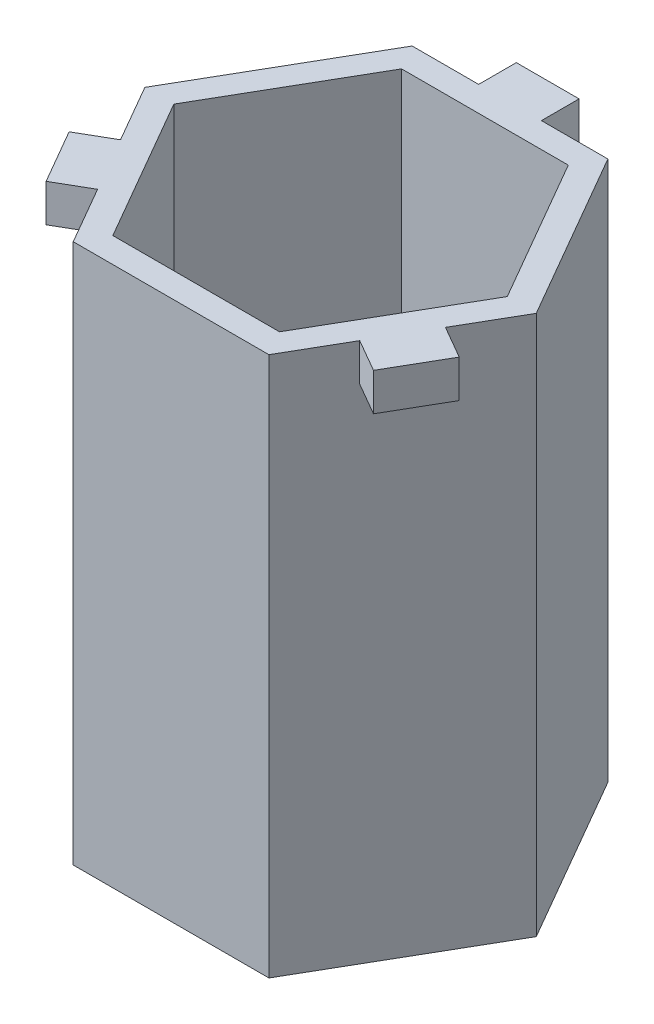
ISO-10303-21;
HEADER;
FILE_DESCRIPTION(('STEP AP214'),'2;1');
FILE_NAME('part.step','',(''),(''),'','','');
FILE_SCHEMA(('AUTOMOTIVE_DESIGN { 1 0 10303 214 1 1 1 1 }'));
ENDSEC;
DATA;
#1=APPLICATION_CONTEXT('core data for automotive mechanical design processes');
#2=APPLICATION_PROTOCOL_DEFINITION('international standard','automotive_design',2000,#1);
#3=PRODUCT_CONTEXT('',#1,'mechanical');
#4=PRODUCT('Part','Part','',(#3));
#5=PRODUCT_RELATED_PRODUCT_CATEGORY('part','',(#4));
#6=PRODUCT_DEFINITION_FORMATION('','',#4);
#7=PRODUCT_DEFINITION_CONTEXT('part definition',#1,'design');
#8=PRODUCT_DEFINITION('design','',#6,#7);
#9=PRODUCT_DEFINITION_SHAPE('','',#8);
#10=(LENGTH_UNIT() NAMED_UNIT(*) SI_UNIT(.MILLI.,.METRE.));
#11=(NAMED_UNIT(*) PLANE_ANGLE_UNIT() SI_UNIT($,.RADIAN.));
#12=(NAMED_UNIT(*) SI_UNIT($,.STERADIAN.) SOLID_ANGLE_UNIT());
#13=UNCERTAINTY_MEASURE_WITH_UNIT(LENGTH_MEASURE(1.E-05),#10,'distance_accuracy_value','');
#14=(GEOMETRIC_REPRESENTATION_CONTEXT(3) GLOBAL_UNCERTAINTY_ASSIGNED_CONTEXT((#13)) GLOBAL_UNIT_ASSIGNED_CONTEXT((#10,
#11,#12)) REPRESENTATION_CONTEXT('',''));
#15=CARTESIAN_POINT('',(0.,0.,0.));
#16=DIRECTION('',(0.,0.,1.));
#17=DIRECTION('',(1.,0.,0.));
#18=AXIS2_PLACEMENT_3D('',#15,#16,#17);
#19=CARTESIAN_POINT('',(7.79422863405995,43.,-13.5));
#20=DIRECTION('',(0.,0.,1.));
#21=DIRECTION('',(1.,0.,0.));
#22=AXIS2_PLACEMENT_3D('',#19,#20,#21);
#23=PLANE('',#22);
#24=DIRECTION('',(0.,1.,0.));
#25=VECTOR('',#24,1.);
#26=CARTESIAN_POINT('',(-2.5,40.,-13.5));
#27=LINE('',#26,#25);
#28=CARTESIAN_POINT('',(-2.5,40.,-13.5));
#29=VERTEX_POINT('',#28);
#30=CARTESIAN_POINT('',(-2.5,43.,-13.5));
#31=VERTEX_POINT('',#30);
#32=EDGE_CURVE('E277',#29,#31,#27,.T.);
#33=ORIENTED_EDGE('',*,*,#32,.F.);
#34=DIRECTION('',(1.,0.,0.));
#35=VECTOR('',#34,1.);
#36=CARTESIAN_POINT('',(-2.5,40.,-13.5));
#37=LINE('',#36,#35);
#38=CARTESIAN_POINT('',(2.5,40.,-13.5));
#39=VERTEX_POINT('',#38);
#40=EDGE_CURVE('E267',#29,#39,#37,.T.);
#41=ORIENTED_EDGE('',*,*,#40,.T.);
#42=DIRECTION('',(0.,1.,0.));
#43=VECTOR('',#42,1.);
#44=CARTESIAN_POINT('',(2.5,40.,-13.5));
#45=LINE('',#44,#43);
#46=CARTESIAN_POINT('',(2.5,43.,-13.5));
#47=VERTEX_POINT('',#46);
#48=EDGE_CURVE('E290',#39,#47,#45,.T.);
#49=ORIENTED_EDGE('',*,*,#48,.T.);
#50=DIRECTION('',(-1.,0.,0.));
#51=VECTOR('',#50,1.);
#52=CARTESIAN_POINT('',(7.79422863405995,43.,-13.5));
#53=LINE('',#52,#51);
#54=CARTESIAN_POINT('',(7.79422863405995,43.,-13.5));
#55=VERTEX_POINT('',#54);
#56=EDGE_CURVE('E345',#55,#47,#53,.T.);
#57=ORIENTED_EDGE('',*,*,#56,.F.);
#58=DIRECTION('',(0.,-1.,0.));
#59=VECTOR('',#58,1.);
#60=CARTESIAN_POINT('',(7.79422863405995,43.,-13.5));
#61=LINE('',#60,#59);
#62=CARTESIAN_POINT('',(7.79422863405995,0.,-13.5));
#63=VERTEX_POINT('',#62);
#64=EDGE_CURVE('E48',#55,#63,#61,.T.);
#65=ORIENTED_EDGE('',*,*,#64,.T.);
#66=DIRECTION('',(-1.,0.,0.));
#67=VECTOR('',#66,1.);
#68=CARTESIAN_POINT('',(7.79422863405995,0.,-13.5));
#69=LINE('',#68,#67);
#70=CARTESIAN_POINT('',(-7.79422863405995,0.,-13.5));
#71=VERTEX_POINT('',#70);
#72=EDGE_CURVE('E359',#63,#71,#69,.T.);
#73=ORIENTED_EDGE('',*,*,#72,.T.);
#74=DIRECTION('',(0.,-1.,0.));
#75=VECTOR('',#74,1.);
#76=CARTESIAN_POINT('',(-7.79422863405995,43.,-13.5));
#77=LINE('',#76,#75);
#78=CARTESIAN_POINT('',(-7.79422863405995,43.,-13.5));
#79=VERTEX_POINT('',#78);
#80=EDGE_CURVE('E375',#79,#71,#77,.T.);
#81=ORIENTED_EDGE('',*,*,#80,.F.);
#82=EDGE_CURVE('E344',#31,#79,#53,.T.);
#83=ORIENTED_EDGE('',*,*,#82,.F.);
#84=EDGE_LOOP('',(#33,#41,#49,#57,#65,#73,#81,#83));
#85=FACE_BOUND('',#84,.T.);
#86=ADVANCED_FACE('F39',(#85),#23,.F.);
#87=CARTESIAN_POINT('',(0.,43.,0.));
#88=DIRECTION('',(0.,-1.,0.));
#89=DIRECTION('',(0.,0.,-1.));
#90=AXIS2_PLACEMENT_3D('',#87,#88,#89);
#91=CYLINDRICAL_SURFACE('',#90,10.7);
#92=CARTESIAN_POINT('',(0.,0.,0.));
#93=DIRECTION('',(0.,1.,0.));
#94=DIRECTION('',(0.,0.,1.));
#95=AXIS2_PLACEMENT_3D('',#92,#93,#94);
#96=CIRCLE('',#95,10.7);
#97=CARTESIAN_POINT('',(0.,0.,10.7));
#98=VERTEX_POINT('',#97);
#99=EDGE_CURVE('E335',#98,#98,#96,.T.);
#100=ORIENTED_EDGE('',*,*,#99,.F.);
#101=EDGE_LOOP('',(#100));
#102=FACE_BOUND('',#101,.T.);
#103=CARTESIAN_POINT('',(0.,3.,0.));
#104=DIRECTION('',(0.,1.,0.));
#105=DIRECTION('',(0.,0.,1.));
#106=AXIS2_PLACEMENT_3D('',#103,#104,#105);
#107=CIRCLE('',#106,10.7);
#108=CARTESIAN_POINT('',(0.,3.,10.7));
#109=VERTEX_POINT('',#108);
#110=EDGE_CURVE('E43',#109,#109,#107,.T.);
#111=ORIENTED_EDGE('',*,*,#110,.T.);
#112=EDGE_LOOP('',(#111));
#113=FACE_BOUND('',#112,.T.);
#114=ADVANCED_FACE('F439',(#102,#113),#91,.F.);
#115=CARTESIAN_POINT('',(0.,43.,0.));
#116=DIRECTION('',(0.,1.,0.));
#117=DIRECTION('',(0.,0.,1.));
#118=AXIS2_PLACEMENT_3D('',#115,#116,#117);
#119=PLANE('',#118);
#120=DIRECTION('',(0.5,0.,-0.866025403784439));
#121=VECTOR('',#120,1.);
#122=CARTESIAN_POINT('',(6.6395280956807,43.,11.5));
#123=LINE('',#122,#121);
#124=CARTESIAN_POINT('',(6.6395280956807,43.,11.5));
#125=VERTEX_POINT('',#124);
#126=CARTESIAN_POINT('',(13.2790561913614,43.,0.));
#127=VERTEX_POINT('',#126);
#128=EDGE_CURVE('E287',#125,#127,#123,.T.);
#129=ORIENTED_EDGE('',*,*,#128,.F.);
#130=DIRECTION('',(1.,0.,0.));
#131=VECTOR('',#130,1.);
#132=CARTESIAN_POINT('',(-6.6395280956807,43.,11.5));
#133=LINE('',#132,#131);
#134=CARTESIAN_POINT('',(-6.6395280956807,43.,11.5));
#135=VERTEX_POINT('',#134);
#136=EDGE_CURVE('E319',#135,#125,#133,.T.);
#137=ORIENTED_EDGE('',*,*,#136,.F.);
#138=DIRECTION('',(0.5,0.,0.866025403784439));
#139=VECTOR('',#138,1.);
#140=CARTESIAN_POINT('',(-13.2790561913614,43.,0.));
#141=LINE('',#140,#139);
#142=CARTESIAN_POINT('',(-13.2790561913614,43.,0.));
#143=VERTEX_POINT('',#142);
#144=EDGE_CURVE('E316',#143,#135,#141,.T.);
#145=ORIENTED_EDGE('',*,*,#144,.F.);
#146=DIRECTION('',(-0.5,0.,0.866025403784439));
#147=VECTOR('',#146,1.);
#148=CARTESIAN_POINT('',(-6.6395280956807,43.,-11.5));
#149=LINE('',#148,#147);
#150=CARTESIAN_POINT('',(-6.6395280956807,43.,-11.5));
#151=VERTEX_POINT('',#150);
#152=EDGE_CURVE('E313',#151,#143,#149,.T.);
#153=ORIENTED_EDGE('',*,*,#152,.F.);
#154=DIRECTION('',(-1.,0.,0.));
#155=VECTOR('',#154,1.);
#156=CARTESIAN_POINT('',(6.63952809568069,43.,-11.5));
#157=LINE('',#156,#155);
#158=CARTESIAN_POINT('',(6.63952809568069,43.,-11.5));
#159=VERTEX_POINT('',#158);
#160=EDGE_CURVE('E310',#159,#151,#157,.T.);
#161=ORIENTED_EDGE('',*,*,#160,.F.);
#162=DIRECTION('',(-0.5,0.,-0.866025403784439));
#163=VECTOR('',#162,1.);
#164=CARTESIAN_POINT('',(13.2790561913614,43.,0.));
#165=LINE('',#164,#163);
#166=EDGE_CURVE('E307',#127,#159,#165,.T.);
#167=ORIENTED_EDGE('',*,*,#166,.F.);
#168=EDGE_LOOP('',(#129,#137,#145,#153,#161,#167));
#169=FACE_BOUND('',#168,.T.);
#170=DIRECTION('',(0.499999999999999,0.,-0.866025403784439));
#171=VECTOR('',#170,1.);
#172=CARTESIAN_POINT('',(7.79422863405995,43.,13.5));
#173=LINE('',#172,#171);
#174=CARTESIAN_POINT('',(7.79422863405995,43.,13.5));
#175=VERTEX_POINT('',#174);
#176=CARTESIAN_POINT('',(10.4413429510904,43.,8.91506350946066));
#177=VERTEX_POINT('',#176);
#178=EDGE_CURVE('E339',#175,#177,#173,.T.);
#179=ORIENTED_EDGE('',*,*,#178,.T.);
#180=DIRECTION('',(0.866025403784439,0.,0.499999999999999));
#181=VECTOR('',#180,1.);
#182=CARTESIAN_POINT('',(13.0394191624438,43.,10.4150635094607));
#183=LINE('',#182,#181);
#184=CARTESIAN_POINT('',(13.0394191624438,43.,10.4150635094607));
#185=VERTEX_POINT('',#184);
#186=EDGE_CURVE('E246',#177,#185,#183,.T.);
#187=ORIENTED_EDGE('',*,*,#186,.T.);
#188=DIRECTION('',(0.5,0.,-0.866025403784439));
#189=VECTOR('',#188,1.);
#190=CARTESIAN_POINT('',(15.5394191624438,43.,6.08493649053846));
#191=LINE('',#190,#189);
#192=CARTESIAN_POINT('',(15.5394191624438,43.,6.08493649053846));
#193=VERTEX_POINT('',#192);
#194=EDGE_CURVE('E251',#185,#193,#191,.T.);
#195=ORIENTED_EDGE('',*,*,#194,.T.);
#196=DIRECTION('',(-0.866025403784438,0.,-0.500000000000001));
#197=VECTOR('',#196,1.);
#198=CARTESIAN_POINT('',(15.5394191624438,43.,6.08493649053846));
#199=LINE('',#198,#197);
#200=CARTESIAN_POINT('',(12.9413429510902,43.,4.58493649053846));
#201=VERTEX_POINT('',#200);
#202=EDGE_CURVE('E62',#193,#201,#199,.T.);
#203=ORIENTED_EDGE('',*,*,#202,.T.);
#204=CARTESIAN_POINT('',(15.5884572681199,43.,0.));
#205=VERTEX_POINT('',#204);
#206=EDGE_CURVE('E342',#201,#205,#173,.T.);
#207=ORIENTED_EDGE('',*,*,#206,.T.);
#208=DIRECTION('',(-0.5,0.,-0.866025403784439));
#209=VECTOR('',#208,1.);
#210=CARTESIAN_POINT('',(15.5884572681199,43.,0.));
#211=LINE('',#210,#209);
#212=EDGE_CURVE('E341',#205,#55,#211,.T.);
#213=ORIENTED_EDGE('',*,*,#212,.T.);
#214=ORIENTED_EDGE('',*,*,#56,.T.);
#215=DIRECTION('',(0.,0.,-1.));
#216=VECTOR('',#215,1.);
#217=CARTESIAN_POINT('',(2.5,43.,-16.5));
#218=LINE('',#217,#216);
#219=CARTESIAN_POINT('',(2.5,43.,-16.5));
#220=VERTEX_POINT('',#219);
#221=EDGE_CURVE('E280',#47,#220,#218,.T.);
#222=ORIENTED_EDGE('',*,*,#221,.T.);
#223=DIRECTION('',(-1.,0.,0.));
#224=VECTOR('',#223,1.);
#225=CARTESIAN_POINT('',(-2.5,43.,-16.5));
#226=LINE('',#225,#224);
#227=CARTESIAN_POINT('',(-2.5,43.,-16.5));
#228=VERTEX_POINT('',#227);
#229=EDGE_CURVE('E268',#220,#228,#226,.T.);
#230=ORIENTED_EDGE('',*,*,#229,.T.);
#231=DIRECTION('',(0.,0.,1.));
#232=VECTOR('',#231,1.);
#233=CARTESIAN_POINT('',(-2.5,43.,-16.5));
#234=LINE('',#233,#232);
#235=EDGE_CURVE('E253',#228,#31,#234,.T.);
#236=ORIENTED_EDGE('',*,*,#235,.T.);
#237=ORIENTED_EDGE('',*,*,#82,.T.);
#238=DIRECTION('',(-0.5,0.,0.866025403784439));
#239=VECTOR('',#238,1.);
#240=CARTESIAN_POINT('',(-7.79422863405995,43.,-13.5));
#241=LINE('',#240,#239);
#242=CARTESIAN_POINT('',(-15.5884572681199,43.,0.));
#243=VERTEX_POINT('',#242);
#244=EDGE_CURVE('E348',#79,#243,#241,.T.);
#245=ORIENTED_EDGE('',*,*,#244,.T.);
#246=DIRECTION('',(0.5,0.,0.866025403784438));
#247=VECTOR('',#246,1.);
#248=CARTESIAN_POINT('',(-15.5884572681199,43.,0.));
#249=LINE('',#248,#247);
#250=CARTESIAN_POINT('',(-12.9413429510893,43.,4.58493649053914));
#251=VERTEX_POINT('',#250);
#252=EDGE_CURVE('E223',#243,#251,#249,.T.);
#253=ORIENTED_EDGE('',*,*,#252,.T.);
#254=DIRECTION('',(-0.866025403784438,0.,0.500000000000001));
#255=VECTOR('',#254,1.);
#256=CARTESIAN_POINT('',(-15.5394191624426,43.,6.08493649053914));
#257=LINE('',#256,#255);
#258=CARTESIAN_POINT('',(-15.5394191624426,43.,6.08493649053914));
#259=VERTEX_POINT('',#258);
#260=EDGE_CURVE('E205',#251,#259,#257,.T.);
#261=ORIENTED_EDGE('',*,*,#260,.T.);
#262=DIRECTION('',(0.5,0.,0.866025403784438));
#263=VECTOR('',#262,1.);
#264=CARTESIAN_POINT('',(-13.0394191624426,43.,10.4150635094613));
#265=LINE('',#264,#263);
#266=CARTESIAN_POINT('',(-13.0394191624426,43.,10.4150635094613));
#267=VERTEX_POINT('',#266);
#268=EDGE_CURVE('E214',#259,#267,#265,.T.);
#269=ORIENTED_EDGE('',*,*,#268,.T.);
#270=DIRECTION('',(0.866025403784439,0.,-0.499999999999999));
#271=VECTOR('',#270,1.);
#272=CARTESIAN_POINT('',(-13.0394191624426,43.,10.4150635094613));
#273=LINE('',#272,#271);
#274=CARTESIAN_POINT('',(-10.4413429510893,43.,8.9150635094622));
#275=VERTEX_POINT('',#274);
#276=EDGE_CURVE('E55',#267,#275,#273,.T.);
#277=ORIENTED_EDGE('',*,*,#276,.T.);
#278=CARTESIAN_POINT('',(-7.79422863405994,43.,13.5));
#279=VERTEX_POINT('',#278);
#280=EDGE_CURVE('E350',#275,#279,#249,.T.);
#281=ORIENTED_EDGE('',*,*,#280,.T.);
#282=DIRECTION('',(1.,0.,0.));
#283=VECTOR('',#282,1.);
#284=CARTESIAN_POINT('',(-7.79422863405994,43.,13.5));
#285=LINE('',#284,#283);
#286=EDGE_CURVE('E352',#279,#175,#285,.T.);
#287=ORIENTED_EDGE('',*,*,#286,.T.);
#288=EDGE_LOOP('',(#179,#187,#195,#203,#207,#213,#214,#222,#230,#236,#237,#245,#253,#261,#269,
#277,#281,#287));
#289=FACE_BOUND('',#288,.T.);
#290=ADVANCED_FACE('F221',(#169,#289),#119,.T.);
#291=CARTESIAN_POINT('',(0.,0.,0.));
#292=DIRECTION('',(0.,1.,0.));
#293=DIRECTION('',(0.,0.,1.));
#294=AXIS2_PLACEMENT_3D('',#291,#292,#293);
#295=PLANE('',#294);
#296=DIRECTION('',(0.499999999999999,0.,-0.866025403784439));
#297=VECTOR('',#296,1.);
#298=CARTESIAN_POINT('',(7.79422863405995,0.,13.5));
#299=LINE('',#298,#297);
#300=CARTESIAN_POINT('',(7.79422863405995,0.,13.5));
#301=VERTEX_POINT('',#300);
#302=CARTESIAN_POINT('',(15.5884572681199,0.,0.));
#303=VERTEX_POINT('',#302);
#304=EDGE_CURVE('E338',#301,#303,#299,.T.);
#305=ORIENTED_EDGE('',*,*,#304,.F.);
#306=DIRECTION('',(1.,0.,0.));
#307=VECTOR('',#306,1.);
#308=CARTESIAN_POINT('',(-7.79422863405994,0.,13.5));
#309=LINE('',#308,#307);
#310=CARTESIAN_POINT('',(-7.79422863405994,0.,13.5));
#311=VERTEX_POINT('',#310);
#312=EDGE_CURVE('E365',#311,#301,#309,.T.);
#313=ORIENTED_EDGE('',*,*,#312,.F.);
#314=DIRECTION('',(0.5,0.,0.866025403784438));
#315=VECTOR('',#314,1.);
#316=CARTESIAN_POINT('',(-15.5884572681199,0.,0.));
#317=LINE('',#316,#315);
#318=CARTESIAN_POINT('',(-15.5884572681199,0.,0.));
#319=VERTEX_POINT('',#318);
#320=EDGE_CURVE('E363',#319,#311,#317,.T.);
#321=ORIENTED_EDGE('',*,*,#320,.F.);
#322=DIRECTION('',(-0.5,0.,0.866025403784439));
#323=VECTOR('',#322,1.);
#324=CARTESIAN_POINT('',(-7.79422863405995,0.,-13.5));
#325=LINE('',#324,#323);
#326=EDGE_CURVE('E361',#71,#319,#325,.T.);
#327=ORIENTED_EDGE('',*,*,#326,.F.);
#328=ORIENTED_EDGE('',*,*,#72,.F.);
#329=DIRECTION('',(-0.5,0.,-0.866025403784439));
#330=VECTOR('',#329,1.);
#331=CARTESIAN_POINT('',(15.5884572681199,0.,0.));
#332=LINE('',#331,#330);
#333=EDGE_CURVE('E357',#303,#63,#332,.T.);
#334=ORIENTED_EDGE('',*,*,#333,.F.);
#335=EDGE_LOOP('',(#305,#313,#321,#327,#328,#334));
#336=FACE_BOUND('',#335,.T.);
#337=ORIENTED_EDGE('',*,*,#99,.T.);
#338=EDGE_LOOP('',(#337));
#339=FACE_BOUND('',#338,.T.);
#340=ADVANCED_FACE('F390',(#336,#339),#295,.F.);
#341=CARTESIAN_POINT('',(7.79422863405995,43.,13.5));
#342=DIRECTION('',(-0.866025403784439,0.,-0.499999999999999));
#343=DIRECTION('',(-0.499999999999999,0.,0.866025403784439));
#344=AXIS2_PLACEMENT_3D('',#341,#342,#343);
#345=PLANE('',#344);
#346=DIRECTION('',(-0.5,0.,0.866025403784439));
#347=VECTOR('',#346,1.);
#348=CARTESIAN_POINT('',(12.9413429510904,40.,4.58493649053846));
#349=LINE('',#348,#347);
#350=CARTESIAN_POINT('',(12.9413429510904,40.,4.58493649053846));
#351=VERTEX_POINT('',#350);
#352=CARTESIAN_POINT('',(10.4413429510904,40.,8.91506350946066));
#353=VERTEX_POINT('',#352);
#354=EDGE_CURVE('E256',#351,#353,#349,.T.);
#355=ORIENTED_EDGE('',*,*,#354,.T.);
#356=DIRECTION('',(0.,1.,0.));
#357=VECTOR('',#356,1.);
#358=CARTESIAN_POINT('',(10.4413429510904,40.,8.91506350946066));
#359=LINE('',#358,#357);
#360=EDGE_CURVE('E242',#353,#177,#359,.T.);
#361=ORIENTED_EDGE('',*,*,#360,.T.);
#362=ORIENTED_EDGE('',*,*,#178,.F.);
#363=DIRECTION('',(0.,-1.,0.));
#364=VECTOR('',#363,1.);
#365=CARTESIAN_POINT('',(7.79422863405995,43.,13.5));
#366=LINE('',#365,#364);
#367=EDGE_CURVE('E354',#175,#301,#366,.T.);
#368=ORIENTED_EDGE('',*,*,#367,.T.);
#369=ORIENTED_EDGE('',*,*,#304,.T.);
#370=DIRECTION('',(0.,-1.,0.));
#371=VECTOR('',#370,1.);
#372=CARTESIAN_POINT('',(15.5884572681199,43.,0.));
#373=LINE('',#372,#371);
#374=EDGE_CURVE('E12',#205,#303,#373,.T.);
#375=ORIENTED_EDGE('',*,*,#374,.F.);
#376=ORIENTED_EDGE('',*,*,#206,.F.);
#377=DIRECTION('',(0.,1.,0.));
#378=VECTOR('',#377,1.);
#379=CARTESIAN_POINT('',(12.9413429510904,40.,4.58493649053846));
#380=LINE('',#379,#378);
#381=EDGE_CURVE('E240',#351,#201,#380,.T.);
#382=ORIENTED_EDGE('',*,*,#381,.F.);
#383=EDGE_LOOP('',(#355,#361,#362,#368,#369,#375,#376,#382));
#384=FACE_BOUND('',#383,.T.);
#385=ADVANCED_FACE('F41',(#384),#345,.F.);
#386=CARTESIAN_POINT('',(15.5884572681199,43.,0.));
#387=DIRECTION('',(-0.866025403784439,0.,0.5));
#388=DIRECTION('',(0.5,0.,0.866025403784439));
#389=AXIS2_PLACEMENT_3D('',#386,#387,#388);
#390=PLANE('',#389);
#391=ORIENTED_EDGE('',*,*,#333,.T.);
#392=ORIENTED_EDGE('',*,*,#64,.F.);
#393=ORIENTED_EDGE('',*,*,#212,.F.);
#394=ORIENTED_EDGE('',*,*,#374,.T.);
#395=EDGE_LOOP('',(#391,#392,#393,#394));
#396=FACE_BOUND('',#395,.T.);
#397=ADVANCED_FACE('F430',(#396),#390,.F.);
#398=CARTESIAN_POINT('',(-7.79422863405995,43.,-13.5));
#399=DIRECTION('',(0.866025403784439,0.,0.5));
#400=DIRECTION('',(0.5,0.,-0.866025403784439));
#401=AXIS2_PLACEMENT_3D('',#398,#399,#400);
#402=PLANE('',#401);
#403=ORIENTED_EDGE('',*,*,#326,.T.);
#404=DIRECTION('',(0.,-1.,0.));
#405=VECTOR('',#404,1.);
#406=CARTESIAN_POINT('',(-15.5884572681199,43.,0.));
#407=LINE('',#406,#405);
#408=EDGE_CURVE('E372',#243,#319,#407,.T.);
#409=ORIENTED_EDGE('',*,*,#408,.F.);
#410=ORIENTED_EDGE('',*,*,#244,.F.);
#411=ORIENTED_EDGE('',*,*,#80,.T.);
#412=EDGE_LOOP('',(#403,#409,#410,#411));
#413=FACE_BOUND('',#412,.T.);
#414=ADVANCED_FACE('F396',(#413),#402,.F.);
#415=CARTESIAN_POINT('',(-15.5884572681199,43.,0.));
#416=DIRECTION('',(0.866025403784439,0.,-0.5));
#417=DIRECTION('',(-0.5,0.,-0.866025403784439));
#418=AXIS2_PLACEMENT_3D('',#415,#416,#417);
#419=PLANE('',#418);
#420=DIRECTION('',(-0.5,0.,-0.866025403784438));
#421=VECTOR('',#420,1.);
#422=CARTESIAN_POINT('',(-10.4413429510893,40.,8.91506350946134));
#423=LINE('',#422,#421);
#424=CARTESIAN_POINT('',(-10.4413429510893,40.,8.91506350946134));
#425=VERTEX_POINT('',#424);
#426=CARTESIAN_POINT('',(-12.9413429510893,40.,4.58493649053914));
#427=VERTEX_POINT('',#426);
#428=EDGE_CURVE('E232',#425,#427,#423,.T.);
#429=ORIENTED_EDGE('',*,*,#428,.T.);
#430=DIRECTION('',(0.,1.,0.));
#431=VECTOR('',#430,1.);
#432=CARTESIAN_POINT('',(-12.9413429510893,40.,4.58493649053914));
#433=LINE('',#432,#431);
#434=EDGE_CURVE('E212',#427,#251,#433,.T.);
#435=ORIENTED_EDGE('',*,*,#434,.T.);
#436=ORIENTED_EDGE('',*,*,#252,.F.);
#437=ORIENTED_EDGE('',*,*,#408,.T.);
#438=ORIENTED_EDGE('',*,*,#320,.T.);
#439=DIRECTION('',(0.,-1.,0.));
#440=VECTOR('',#439,1.);
#441=CARTESIAN_POINT('',(-7.79422863405994,43.,13.5));
#442=LINE('',#441,#440);
#443=EDGE_CURVE('E369',#279,#311,#442,.T.);
#444=ORIENTED_EDGE('',*,*,#443,.F.);
#445=ORIENTED_EDGE('',*,*,#280,.F.);
#446=DIRECTION('',(0.,1.,0.));
#447=VECTOR('',#446,1.);
#448=CARTESIAN_POINT('',(-10.4413429510893,40.,8.91506350946134));
#449=LINE('',#448,#447);
#450=EDGE_CURVE('E402',#425,#275,#449,.T.);
#451=ORIENTED_EDGE('',*,*,#450,.F.);
#452=EDGE_LOOP('',(#429,#435,#436,#437,#438,#444,#445,#451));
#453=FACE_BOUND('',#452,.T.);
#454=ADVANCED_FACE('F399',(#453),#419,.F.);
#455=CARTESIAN_POINT('',(-7.79422863405994,43.,13.5));
#456=DIRECTION('',(0.,0.,-1.));
#457=DIRECTION('',(-1.,0.,0.));
#458=AXIS2_PLACEMENT_3D('',#455,#456,#457);
#459=PLANE('',#458);
#460=ORIENTED_EDGE('',*,*,#312,.T.);
#461=ORIENTED_EDGE('',*,*,#367,.F.);
#462=ORIENTED_EDGE('',*,*,#286,.F.);
#463=ORIENTED_EDGE('',*,*,#443,.T.);
#464=EDGE_LOOP('',(#460,#461,#462,#463));
#465=FACE_BOUND('',#464,.T.);
#466=ADVANCED_FACE('F413',(#465),#459,.F.);
#467=CARTESIAN_POINT('',(6.6395280956807,-35.1330803279948,11.5));
#468=DIRECTION('',(0.866025403784439,0.,0.5));
#469=DIRECTION('',(0.5,0.,-0.866025403784439));
#470=AXIS2_PLACEMENT_3D('',#467,#468,#469);
#471=PLANE('',#470);
#472=DIRECTION('',(-0.5,0.,0.866025403784439));
#473=VECTOR('',#472,1.);
#474=CARTESIAN_POINT('',(6.6395280956807,3.,11.5));
#475=LINE('',#474,#473);
#476=CARTESIAN_POINT('',(13.2790561913614,3.,0.));
#477=VERTEX_POINT('',#476);
#478=CARTESIAN_POINT('',(6.6395280956807,3.,11.5));
#479=VERTEX_POINT('',#478);
#480=EDGE_CURVE('E303',#477,#479,#475,.T.);
#481=ORIENTED_EDGE('',*,*,#480,.T.);
#482=DIRECTION('',(0.,1.,0.));
#483=VECTOR('',#482,1.);
#484=CARTESIAN_POINT('',(6.6395280956807,-35.1330803279948,11.5));
#485=LINE('',#484,#483);
#486=EDGE_CURVE('E297',#479,#125,#485,.T.);
#487=ORIENTED_EDGE('',*,*,#486,.T.);
#488=ORIENTED_EDGE('',*,*,#128,.T.);
#489=DIRECTION('',(0.,1.,0.));
#490=VECTOR('',#489,1.);
#491=CARTESIAN_POINT('',(13.2790561913614,-35.1330803279948,0.));
#492=LINE('',#491,#490);
#493=EDGE_CURVE('E322',#477,#127,#492,.T.);
#494=ORIENTED_EDGE('',*,*,#493,.F.);
#495=EDGE_LOOP('',(#481,#487,#488,#494));
#496=FACE_BOUND('',#495,.T.);
#497=ADVANCED_FACE('F450',(#496),#471,.F.);
#498=CARTESIAN_POINT('',(-6.6395280956807,-35.1330803279948,11.5));
#499=DIRECTION('',(0.,0.,1.));
#500=DIRECTION('',(1.,0.,0.));
#501=AXIS2_PLACEMENT_3D('',#498,#499,#500);
#502=PLANE('',#501);
#503=DIRECTION('',(-1.,0.,0.));
#504=VECTOR('',#503,1.);
#505=CARTESIAN_POINT('',(-6.6395280956807,3.,11.5));
#506=LINE('',#505,#504);
#507=CARTESIAN_POINT('',(-6.6395280956807,3.,11.5));
#508=VERTEX_POINT('',#507);
#509=EDGE_CURVE('E301',#479,#508,#506,.T.);
#510=ORIENTED_EDGE('',*,*,#509,.T.);
#511=DIRECTION('',(0.,1.,0.));
#512=VECTOR('',#511,1.);
#513=CARTESIAN_POINT('',(-6.6395280956807,-35.1330803279948,11.5));
#514=LINE('',#513,#512);
#515=EDGE_CURVE('E324',#508,#135,#514,.T.);
#516=ORIENTED_EDGE('',*,*,#515,.T.);
#517=ORIENTED_EDGE('',*,*,#136,.T.);
#518=ORIENTED_EDGE('',*,*,#486,.F.);
#519=EDGE_LOOP('',(#510,#516,#517,#518));
#520=FACE_BOUND('',#519,.T.);
#521=ADVANCED_FACE('F458',(#520),#502,.F.);
#522=CARTESIAN_POINT('',(-13.2790561913614,-35.1330803279948,0.));
#523=DIRECTION('',(-0.866025403784439,0.,0.5));
#524=DIRECTION('',(0.5,0.,0.866025403784439));
#525=AXIS2_PLACEMENT_3D('',#522,#523,#524);
#526=PLANE('',#525);
#527=DIRECTION('',(-0.5,0.,-0.866025403784439));
#528=VECTOR('',#527,1.);
#529=CARTESIAN_POINT('',(-13.2790561913614,3.,0.));
#530=LINE('',#529,#528);
#531=CARTESIAN_POINT('',(-13.2790561913614,3.,0.));
#532=VERTEX_POINT('',#531);
#533=EDGE_CURVE('E299',#508,#532,#530,.T.);
#534=ORIENTED_EDGE('',*,*,#533,.T.);
#535=DIRECTION('',(0.,1.,0.));
#536=VECTOR('',#535,1.);
#537=CARTESIAN_POINT('',(-13.2790561913614,-35.1330803279948,0.));
#538=LINE('',#537,#536);
#539=EDGE_CURVE('E326',#532,#143,#538,.T.);
#540=ORIENTED_EDGE('',*,*,#539,.T.);
#541=ORIENTED_EDGE('',*,*,#144,.T.);
#542=ORIENTED_EDGE('',*,*,#515,.F.);
#543=EDGE_LOOP('',(#534,#540,#541,#542));
#544=FACE_BOUND('',#543,.T.);
#545=ADVANCED_FACE('F472',(#544),#526,.F.);
#546=CARTESIAN_POINT('',(-6.6395280956807,-35.1330803279948,-11.5));
#547=DIRECTION('',(-0.866025403784439,0.,-0.5));
#548=DIRECTION('',(-0.5,0.,0.866025403784439));
#549=AXIS2_PLACEMENT_3D('',#546,#547,#548);
#550=PLANE('',#549);
#551=DIRECTION('',(0.5,0.,-0.866025403784439));
#552=VECTOR('',#551,1.);
#553=CARTESIAN_POINT('',(-6.6395280956807,3.,-11.5));
#554=LINE('',#553,#552);
#555=CARTESIAN_POINT('',(-6.6395280956807,3.,-11.5));
#556=VERTEX_POINT('',#555);
#557=EDGE_CURVE('E296',#532,#556,#554,.T.);
#558=ORIENTED_EDGE('',*,*,#557,.T.);
#559=DIRECTION('',(0.,1.,0.));
#560=VECTOR('',#559,1.);
#561=CARTESIAN_POINT('',(-6.6395280956807,-35.1330803279948,-11.5));
#562=LINE('',#561,#560);
#563=EDGE_CURVE('E328',#556,#151,#562,.T.);
#564=ORIENTED_EDGE('',*,*,#563,.T.);
#565=ORIENTED_EDGE('',*,*,#152,.T.);
#566=ORIENTED_EDGE('',*,*,#539,.F.);
#567=EDGE_LOOP('',(#558,#564,#565,#566));
#568=FACE_BOUND('',#567,.T.);
#569=ADVANCED_FACE('F468',(#568),#550,.F.);
#570=CARTESIAN_POINT('',(6.63952809568069,-35.1330803279948,-11.5));
#571=DIRECTION('',(0.,0.,-1.));
#572=DIRECTION('',(-1.,0.,0.));
#573=AXIS2_PLACEMENT_3D('',#570,#571,#572);
#574=PLANE('',#573);
#575=DIRECTION('',(1.,0.,0.));
#576=VECTOR('',#575,1.);
#577=CARTESIAN_POINT('',(6.63952809568069,3.,-11.5));
#578=LINE('',#577,#576);
#579=CARTESIAN_POINT('',(6.63952809568069,3.,-11.5));
#580=VERTEX_POINT('',#579);
#581=EDGE_CURVE('E294',#556,#580,#578,.T.);
#582=ORIENTED_EDGE('',*,*,#581,.T.);
#583=DIRECTION('',(0.,1.,0.));
#584=VECTOR('',#583,1.);
#585=CARTESIAN_POINT('',(6.63952809568069,-35.1330803279948,-11.5));
#586=LINE('',#585,#584);
#587=EDGE_CURVE('E330',#580,#159,#586,.T.);
#588=ORIENTED_EDGE('',*,*,#587,.T.);
#589=ORIENTED_EDGE('',*,*,#160,.T.);
#590=ORIENTED_EDGE('',*,*,#563,.F.);
#591=EDGE_LOOP('',(#582,#588,#589,#590));
#592=FACE_BOUND('',#591,.T.);
#593=ADVANCED_FACE('F464',(#592),#574,.F.);
#594=CARTESIAN_POINT('',(13.2790561913614,-35.1330803279948,0.));
#595=DIRECTION('',(0.866025403784438,0.,-0.5));
#596=DIRECTION('',(-0.5,0.,-0.866025403784439));
#597=AXIS2_PLACEMENT_3D('',#594,#595,#596);
#598=PLANE('',#597);
#599=DIRECTION('',(0.5,0.,0.866025403784439));
#600=VECTOR('',#599,1.);
#601=CARTESIAN_POINT('',(13.2790561913614,3.,0.));
#602=LINE('',#601,#600);
#603=EDGE_CURVE('E305',#580,#477,#602,.T.);
#604=ORIENTED_EDGE('',*,*,#603,.T.);
#605=ORIENTED_EDGE('',*,*,#493,.T.);
#606=ORIENTED_EDGE('',*,*,#166,.T.);
#607=ORIENTED_EDGE('',*,*,#587,.F.);
#608=EDGE_LOOP('',(#604,#605,#606,#607));
#609=FACE_BOUND('',#608,.T.);
#610=ADVANCED_FACE('F460',(#609),#598,.F.);
#611=CARTESIAN_POINT('',(0.,3.,0.));
#612=DIRECTION('',(0.,1.,0.));
#613=DIRECTION('',(0.,0.,1.));
#614=AXIS2_PLACEMENT_3D('',#611,#612,#613);
#615=PLANE('',#614);
#616=ORIENTED_EDGE('',*,*,#110,.F.);
#617=EDGE_LOOP('',(#616));
#618=FACE_BOUND('',#617,.T.);
#619=ORIENTED_EDGE('',*,*,#480,.F.);
#620=ORIENTED_EDGE('',*,*,#603,.F.);
#621=ORIENTED_EDGE('',*,*,#581,.F.);
#622=ORIENTED_EDGE('',*,*,#557,.F.);
#623=ORIENTED_EDGE('',*,*,#533,.F.);
#624=ORIENTED_EDGE('',*,*,#509,.F.);
#625=EDGE_LOOP('',(#619,#620,#621,#622,#623,#624));
#626=FACE_BOUND('',#625,.T.);
#627=ADVANCED_FACE('F463',(#618,#626),#615,.T.);
#628=CARTESIAN_POINT('',(-2.5,40.,-16.5));
#629=DIRECTION('',(-1.,0.,0.));
#630=DIRECTION('',(0.,0.,1.));
#631=AXIS2_PLACEMENT_3D('',#628,#629,#630);
#632=PLANE('',#631);
#633=ORIENTED_EDGE('',*,*,#235,.F.);
#634=DIRECTION('',(0.,1.,0.));
#635=VECTOR('',#634,1.);
#636=CARTESIAN_POINT('',(-2.5,40.,-16.5));
#637=LINE('',#636,#635);
#638=CARTESIAN_POINT('',(-2.5,40.,-16.5));
#639=VERTEX_POINT('',#638);
#640=EDGE_CURVE('E285',#639,#228,#637,.T.);
#641=ORIENTED_EDGE('',*,*,#640,.F.);
#642=DIRECTION('',(0.,0.,1.));
#643=VECTOR('',#642,1.);
#644=CARTESIAN_POINT('',(-2.5,40.,-16.5));
#645=LINE('',#644,#643);
#646=EDGE_CURVE('E264',#639,#29,#645,.T.);
#647=ORIENTED_EDGE('',*,*,#646,.T.);
#648=ORIENTED_EDGE('',*,*,#32,.T.);
#649=EDGE_LOOP('',(#633,#641,#647,#648));
#650=FACE_BOUND('',#649,.T.);
#651=ADVANCED_FACE('F482',(#650),#632,.T.);
#652=CARTESIAN_POINT('',(-2.5,40.,-16.5));
#653=DIRECTION('',(0.,0.,-1.));
#654=DIRECTION('',(-1.,0.,0.));
#655=AXIS2_PLACEMENT_3D('',#652,#653,#654);
#656=PLANE('',#655);
#657=ORIENTED_EDGE('',*,*,#229,.F.);
#658=DIRECTION('',(0.,1.,0.));
#659=VECTOR('',#658,1.);
#660=CARTESIAN_POINT('',(2.5,40.,-16.5));
#661=LINE('',#660,#659);
#662=CARTESIAN_POINT('',(2.5,40.,-16.5));
#663=VERTEX_POINT('',#662);
#664=EDGE_CURVE('E288',#663,#220,#661,.T.);
#665=ORIENTED_EDGE('',*,*,#664,.F.);
#666=DIRECTION('',(-1.,0.,0.));
#667=VECTOR('',#666,1.);
#668=CARTESIAN_POINT('',(-2.5,40.,-16.5));
#669=LINE('',#668,#667);
#670=EDGE_CURVE('E274',#663,#639,#669,.T.);
#671=ORIENTED_EDGE('',*,*,#670,.T.);
#672=ORIENTED_EDGE('',*,*,#640,.T.);
#673=EDGE_LOOP('',(#657,#665,#671,#672));
#674=FACE_BOUND('',#673,.T.);
#675=ADVANCED_FACE('F486',(#674),#656,.T.);
#676=CARTESIAN_POINT('',(2.5,40.,-16.5));
#677=DIRECTION('',(1.,0.,0.));
#678=DIRECTION('',(0.,0.,-1.));
#679=AXIS2_PLACEMENT_3D('',#676,#677,#678);
#680=PLANE('',#679);
#681=ORIENTED_EDGE('',*,*,#221,.F.);
#682=ORIENTED_EDGE('',*,*,#48,.F.);
#683=DIRECTION('',(0.,0.,-1.));
#684=VECTOR('',#683,1.);
#685=CARTESIAN_POINT('',(2.5,40.,-16.5));
#686=LINE('',#685,#684);
#687=EDGE_CURVE('E271',#39,#663,#686,.T.);
#688=ORIENTED_EDGE('',*,*,#687,.T.);
#689=ORIENTED_EDGE('',*,*,#664,.T.);
#690=EDGE_LOOP('',(#681,#682,#688,#689));
#691=FACE_BOUND('',#690,.T.);
#692=ADVANCED_FACE('F488',(#691),#680,.T.);
#693=CARTESIAN_POINT('',(0.,40.,0.));
#694=DIRECTION('',(0.,1.,0.));
#695=DIRECTION('',(0.,0.,1.));
#696=AXIS2_PLACEMENT_3D('',#693,#694,#695);
#697=PLANE('',#696);
#698=ORIENTED_EDGE('',*,*,#646,.F.);
#699=ORIENTED_EDGE('',*,*,#670,.F.);
#700=ORIENTED_EDGE('',*,*,#687,.F.);
#701=ORIENTED_EDGE('',*,*,#40,.F.);
#702=EDGE_LOOP('',(#698,#699,#700,#701));
#703=FACE_BOUND('',#702,.T.);
#704=ADVANCED_FACE('F491',(#703),#697,.F.);
#705=CARTESIAN_POINT('',(15.5394191624438,40.,6.08493649053846));
#706=DIRECTION('',(0.866025403784439,0.,0.5));
#707=DIRECTION('',(0.5,0.,-0.866025403784439));
#708=AXIS2_PLACEMENT_3D('',#705,#706,#707);
#709=PLANE('',#708);
#710=ORIENTED_EDGE('',*,*,#194,.F.);
#711=DIRECTION('',(0.,1.,0.));
#712=VECTOR('',#711,1.);
#713=CARTESIAN_POINT('',(13.0394191624438,40.,10.4150635094607));
#714=LINE('',#713,#712);
#715=CARTESIAN_POINT('',(13.0394191624438,40.,10.4150635094607));
#716=VERTEX_POINT('',#715);
#717=EDGE_CURVE('E217',#716,#185,#714,.T.);
#718=ORIENTED_EDGE('',*,*,#717,.F.);
#719=DIRECTION('',(0.5,0.,-0.866025403784439));
#720=VECTOR('',#719,1.);
#721=CARTESIAN_POINT('',(15.5394191624438,40.,6.08493649053846));
#722=LINE('',#721,#720);
#723=CARTESIAN_POINT('',(15.5394191624438,40.,6.08493649053846));
#724=VERTEX_POINT('',#723);
#725=EDGE_CURVE('E249',#716,#724,#722,.T.);
#726=ORIENTED_EDGE('',*,*,#725,.T.);
#727=DIRECTION('',(0.,1.,0.));
#728=VECTOR('',#727,1.);
#729=CARTESIAN_POINT('',(15.5394191624438,40.,6.08493649053846));
#730=LINE('',#729,#728);
#731=EDGE_CURVE('E237',#724,#193,#730,.T.);
#732=ORIENTED_EDGE('',*,*,#731,.T.);
#733=EDGE_LOOP('',(#710,#718,#726,#732));
#734=FACE_BOUND('',#733,.T.);
#735=ADVANCED_FACE('F425',(#734),#709,.T.);
#736=CARTESIAN_POINT('',(13.0394191624438,40.,10.4150635094607));
#737=DIRECTION('',(-0.499999999999999,0.,0.866025403784439));
#738=DIRECTION('',(0.866025403784439,0.,0.499999999999999));
#739=AXIS2_PLACEMENT_3D('',#736,#737,#738);
#740=PLANE('',#739);
#741=ORIENTED_EDGE('',*,*,#186,.F.);
#742=ORIENTED_EDGE('',*,*,#360,.F.);
#743=DIRECTION('',(0.866025403784439,0.,0.499999999999999));
#744=VECTOR('',#743,1.);
#745=CARTESIAN_POINT('',(13.0394191624438,40.,10.4150635094607));
#746=LINE('',#745,#744);
#747=EDGE_CURVE('E239',#353,#716,#746,.T.);
#748=ORIENTED_EDGE('',*,*,#747,.T.);
#749=ORIENTED_EDGE('',*,*,#717,.T.);
#750=EDGE_LOOP('',(#741,#742,#748,#749));
#751=FACE_BOUND('',#750,.T.);
#752=ADVANCED_FACE('F418',(#751),#740,.T.);
#753=CARTESIAN_POINT('',(15.5394191624438,40.,6.08493649053846));
#754=DIRECTION('',(0.500000000000001,0.,-0.866025403784438));
#755=DIRECTION('',(-0.866025403784438,0.,-0.500000000000001));
#756=AXIS2_PLACEMENT_3D('',#753,#754,#755);
#757=PLANE('',#756);
#758=ORIENTED_EDGE('',*,*,#202,.F.);
#759=ORIENTED_EDGE('',*,*,#731,.F.);
#760=DIRECTION('',(-0.866025403784438,0.,-0.500000000000001));
#761=VECTOR('',#760,1.);
#762=CARTESIAN_POINT('',(15.5394191624438,40.,6.08493649053846));
#763=LINE('',#762,#761);
#764=EDGE_CURVE('E259',#724,#351,#763,.T.);
#765=ORIENTED_EDGE('',*,*,#764,.T.);
#766=ORIENTED_EDGE('',*,*,#381,.T.);
#767=EDGE_LOOP('',(#758,#759,#765,#766));
#768=FACE_BOUND('',#767,.T.);
#769=ADVANCED_FACE('F427',(#768),#757,.T.);
#770=CARTESIAN_POINT('',(0.,40.,0.));
#771=DIRECTION('',(0.,-1.,0.));
#772=DIRECTION('',(0.,0.,-1.));
#773=AXIS2_PLACEMENT_3D('',#770,#771,#772);
#774=PLANE('',#773);
#775=ORIENTED_EDGE('',*,*,#725,.F.);
#776=ORIENTED_EDGE('',*,*,#747,.F.);
#777=ORIENTED_EDGE('',*,*,#354,.F.);
#778=ORIENTED_EDGE('',*,*,#764,.F.);
#779=EDGE_LOOP('',(#775,#776,#777,#778));
#780=FACE_BOUND('',#779,.T.);
#781=ADVANCED_FACE('F421',(#780),#774,.T.);
#782=CARTESIAN_POINT('',(-13.0394191624426,40.,10.4150635094613));
#783=DIRECTION('',(-0.866025403784438,0.,0.5));
#784=DIRECTION('',(0.5,0.,0.866025403784439));
#785=AXIS2_PLACEMENT_3D('',#782,#783,#784);
#786=PLANE('',#785);
#787=ORIENTED_EDGE('',*,*,#268,.F.);
#788=DIRECTION('',(0.,1.,0.));
#789=VECTOR('',#788,1.);
#790=CARTESIAN_POINT('',(-15.5394191624426,40.,6.08493649053914));
#791=LINE('',#790,#789);
#792=CARTESIAN_POINT('',(-15.5394191624426,40.,6.08493649053914));
#793=VERTEX_POINT('',#792);
#794=EDGE_CURVE('E201',#793,#259,#791,.T.);
#795=ORIENTED_EDGE('',*,*,#794,.F.);
#796=DIRECTION('',(0.5,0.,0.866025403784438));
#797=VECTOR('',#796,1.);
#798=CARTESIAN_POINT('',(-13.0394191624426,40.,10.4150635094613));
#799=LINE('',#798,#797);
#800=CARTESIAN_POINT('',(-13.0394191624426,40.,10.4150635094613));
#801=VERTEX_POINT('',#800);
#802=EDGE_CURVE('E224',#793,#801,#799,.T.);
#803=ORIENTED_EDGE('',*,*,#802,.T.);
#804=DIRECTION('',(0.,1.,0.));
#805=VECTOR('',#804,1.);
#806=CARTESIAN_POINT('',(-13.0394191624426,40.,10.4150635094613));
#807=LINE('',#806,#805);
#808=EDGE_CURVE('E216',#801,#267,#807,.T.);
#809=ORIENTED_EDGE('',*,*,#808,.T.);
#810=EDGE_LOOP('',(#787,#795,#803,#809));
#811=FACE_BOUND('',#810,.T.);
#812=ADVANCED_FACE('F215',(#811),#786,.T.);
#813=CARTESIAN_POINT('',(-15.5394191624426,40.,6.08493649053914));
#814=DIRECTION('',(-0.500000000000001,0.,-0.866025403784438));
#815=DIRECTION('',(-0.866025403784438,0.,0.500000000000001));
#816=AXIS2_PLACEMENT_3D('',#813,#814,#815);
#817=PLANE('',#816);
#818=ORIENTED_EDGE('',*,*,#260,.F.);
#819=ORIENTED_EDGE('',*,*,#434,.F.);
#820=DIRECTION('',(-0.866025403784438,0.,0.500000000000001));
#821=VECTOR('',#820,1.);
#822=CARTESIAN_POINT('',(-15.5394191624426,40.,6.08493649053914));
#823=LINE('',#822,#821);
#824=EDGE_CURVE('E208',#427,#793,#823,.T.);
#825=ORIENTED_EDGE('',*,*,#824,.T.);
#826=ORIENTED_EDGE('',*,*,#794,.T.);
#827=EDGE_LOOP('',(#818,#819,#825,#826));
#828=FACE_BOUND('',#827,.T.);
#829=ADVANCED_FACE('F203',(#828),#817,.T.);
#830=CARTESIAN_POINT('',(-13.0394191624426,40.,10.4150635094613));
#831=DIRECTION('',(0.499999999999999,0.,0.866025403784439));
#832=DIRECTION('',(0.866025403784439,0.,-0.499999999999999));
#833=AXIS2_PLACEMENT_3D('',#830,#831,#832);
#834=PLANE('',#833);
#835=ORIENTED_EDGE('',*,*,#276,.F.);
#836=ORIENTED_EDGE('',*,*,#808,.F.);
#837=DIRECTION('',(0.866025403784439,0.,-0.499999999999999));
#838=VECTOR('',#837,1.);
#839=CARTESIAN_POINT('',(-13.0394191624426,40.,10.4150635094613));
#840=LINE('',#839,#838);
#841=EDGE_CURVE('E227',#801,#425,#840,.T.);
#842=ORIENTED_EDGE('',*,*,#841,.T.);
#843=ORIENTED_EDGE('',*,*,#450,.T.);
#844=EDGE_LOOP('',(#835,#836,#842,#843));
#845=FACE_BOUND('',#844,.T.);
#846=ADVANCED_FACE('F407',(#845),#834,.T.);
#847=CARTESIAN_POINT('',(0.,40.,0.));
#848=DIRECTION('',(0.,-1.,0.));
#849=DIRECTION('',(0.,0.,-1.));
#850=AXIS2_PLACEMENT_3D('',#847,#848,#849);
#851=PLANE('',#850);
#852=ORIENTED_EDGE('',*,*,#802,.F.);
#853=ORIENTED_EDGE('',*,*,#824,.F.);
#854=ORIENTED_EDGE('',*,*,#428,.F.);
#855=ORIENTED_EDGE('',*,*,#841,.F.);
#856=EDGE_LOOP('',(#852,#853,#854,#855));
#857=FACE_BOUND('',#856,.T.);
#858=ADVANCED_FACE('F507',(#857),#851,.T.);
#859=CLOSED_SHELL('',(#86,#114,#290,#340,#385,#397,#414,#454,#466,#497,#521,#545,#569,#593,#610,
#627,#651,#675,#692,#704,#735,#752,#769,#781,#812,#829,#846,#858));
#860=MANIFOLD_SOLID_BREP('B2',#859);
#861=ADVANCED_BREP_SHAPE_REPRESENTATION('',(#18,#860),#14);
#862=SHAPE_DEFINITION_REPRESENTATION(#9,#861);
ENDSEC;
END-ISO-10303-21;
